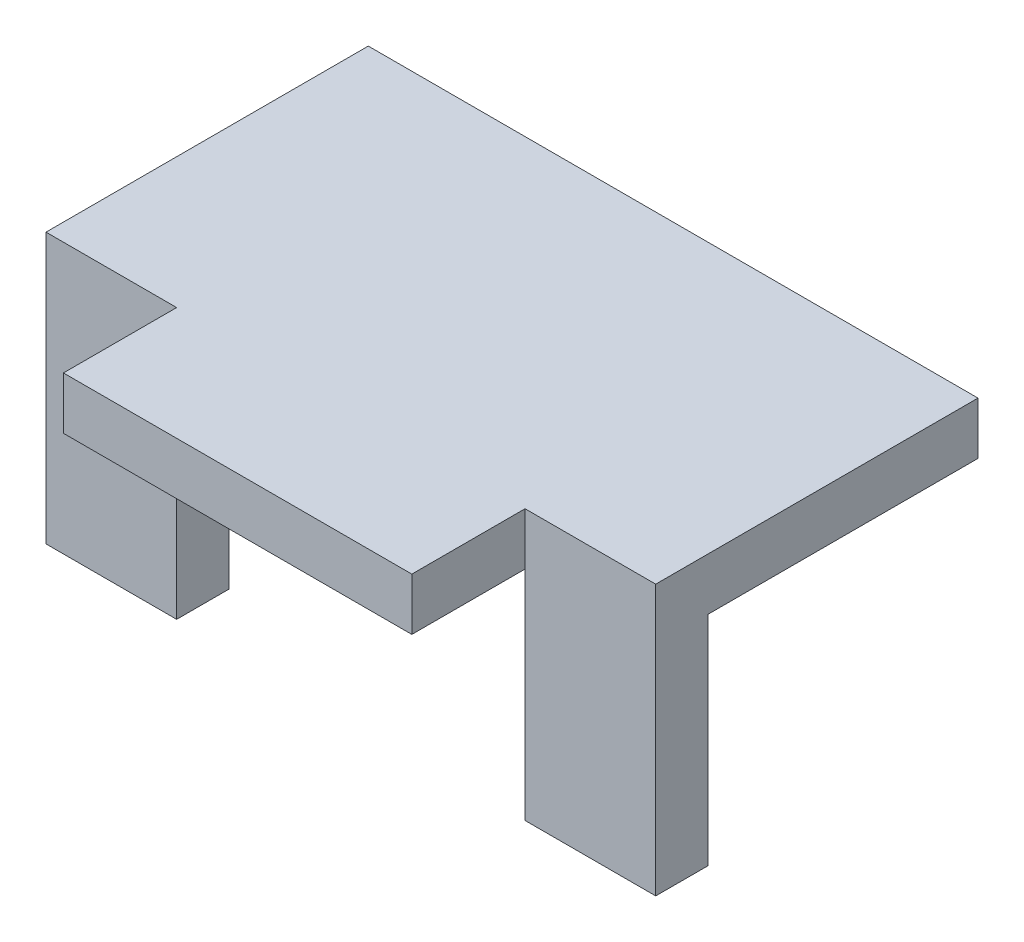
ISO-10303-21;
HEADER;
FILE_DESCRIPTION(('STEP AP214'),'2;1');
FILE_NAME('part.step','',(''),(''),'','','');
FILE_SCHEMA(('AUTOMOTIVE_DESIGN { 1 0 10303 214 1 1 1 1 }'));
ENDSEC;
DATA;
#1=APPLICATION_CONTEXT('core data for automotive mechanical design processes');
#2=APPLICATION_PROTOCOL_DEFINITION('international standard','automotive_design',2000,#1);
#3=PRODUCT_CONTEXT('',#1,'mechanical');
#4=PRODUCT('Part','Part','',(#3));
#5=PRODUCT_RELATED_PRODUCT_CATEGORY('part','',(#4));
#6=PRODUCT_DEFINITION_FORMATION('','',#4);
#7=PRODUCT_DEFINITION_CONTEXT('part definition',#1,'design');
#8=PRODUCT_DEFINITION('design','',#6,#7);
#9=PRODUCT_DEFINITION_SHAPE('','',#8);
#10=(LENGTH_UNIT() NAMED_UNIT(*) SI_UNIT(.MILLI.,.METRE.));
#11=(NAMED_UNIT(*) PLANE_ANGLE_UNIT() SI_UNIT($,.RADIAN.));
#12=(NAMED_UNIT(*) SI_UNIT($,.STERADIAN.) SOLID_ANGLE_UNIT());
#13=UNCERTAINTY_MEASURE_WITH_UNIT(LENGTH_MEASURE(1.E-05),#10,'distance_accuracy_value','');
#14=(GEOMETRIC_REPRESENTATION_CONTEXT(3) GLOBAL_UNCERTAINTY_ASSIGNED_CONTEXT((#13)) GLOBAL_UNIT_ASSIGNED_CONTEXT((#10,
#11,#12)) REPRESENTATION_CONTEXT('',''));
#15=CARTESIAN_POINT('',(0.,0.,0.));
#16=DIRECTION('',(0.,0.,1.));
#17=DIRECTION('',(1.,0.,0.));
#18=AXIS2_PLACEMENT_3D('',#15,#16,#17);
#19=CARTESIAN_POINT('',(0.,0.,0.));
#20=DIRECTION('',(0.,-1.,0.));
#21=DIRECTION('',(0.,0.,-1.));
#22=AXIS2_PLACEMENT_3D('',#19,#20,#21);
#23=PLANE('',#22);
#24=DIRECTION('',(1.,0.,0.));
#25=VECTOR('',#24,1.);
#26=CARTESIAN_POINT('',(20.,0.,6.00000000000001));
#27=LINE('',#26,#25);
#28=CARTESIAN_POINT('',(20.,0.,6.00000000000001));
#29=VERTEX_POINT('',#28);
#30=CARTESIAN_POINT('',(35.,0.,6.00000000000001));
#31=VERTEX_POINT('',#30);
#32=EDGE_CURVE('E150',#29,#31,#27,.T.);
#33=ORIENTED_EDGE('',*,*,#32,.F.);
#34=DIRECTION('',(0.,0.,-1.));
#35=VECTOR('',#34,1.);
#36=CARTESIAN_POINT('',(20.,0.,12.));
#37=LINE('',#36,#35);
#38=CARTESIAN_POINT('',(20.,0.,12.));
#39=VERTEX_POINT('',#38);
#40=EDGE_CURVE('E154',#39,#29,#37,.T.);
#41=ORIENTED_EDGE('',*,*,#40,.F.);
#42=DIRECTION('',(0.,0.,-1.));
#43=VECTOR('',#42,1.);
#44=CARTESIAN_POINT('',(20.,0.,0.));
#45=LINE('',#44,#43);
#46=CARTESIAN_POINT('',(20.,0.,25.));
#47=VERTEX_POINT('',#46);
#48=EDGE_CURVE('E11',#47,#39,#45,.T.);
#49=ORIENTED_EDGE('',*,*,#48,.F.);
#50=DIRECTION('',(1.,0.,0.));
#51=VECTOR('',#50,1.);
#52=CARTESIAN_POINT('',(-35.,0.,25.));
#53=LINE('',#52,#51);
#54=CARTESIAN_POINT('',(-20.,0.,25.));
#55=VERTEX_POINT('',#54);
#56=EDGE_CURVE('E213',#55,#47,#53,.T.);
#57=ORIENTED_EDGE('',*,*,#56,.F.);
#58=DIRECTION('',(0.,0.,1.));
#59=VECTOR('',#58,1.);
#60=CARTESIAN_POINT('',(-20.,0.,12.));
#61=LINE('',#60,#59);
#62=CARTESIAN_POINT('',(-20.,0.,12.));
#63=VERTEX_POINT('',#62);
#64=EDGE_CURVE('E193',#63,#55,#61,.T.);
#65=ORIENTED_EDGE('',*,*,#64,.F.);
#66=DIRECTION('',(0.,0.,1.));
#67=VECTOR('',#66,1.);
#68=CARTESIAN_POINT('',(-20.,0.,12.));
#69=LINE('',#68,#67);
#70=CARTESIAN_POINT('',(-20.,0.,6.00000000000001));
#71=VERTEX_POINT('',#70);
#72=EDGE_CURVE('E156',#71,#63,#69,.T.);
#73=ORIENTED_EDGE('',*,*,#72,.F.);
#74=DIRECTION('',(1.,0.,0.));
#75=VECTOR('',#74,1.);
#76=CARTESIAN_POINT('',(-20.,0.,6.00000000000001));
#77=LINE('',#76,#75);
#78=CARTESIAN_POINT('',(-35.,0.,6.00000000000001));
#79=VERTEX_POINT('',#78);
#80=EDGE_CURVE('E50',#79,#71,#77,.T.);
#81=ORIENTED_EDGE('',*,*,#80,.F.);
#82=DIRECTION('',(0.,0.,1.));
#83=VECTOR('',#82,1.);
#84=CARTESIAN_POINT('',(-35.,0.,25.));
#85=LINE('',#84,#83);
#86=CARTESIAN_POINT('',(-35.,0.,-25.));
#87=VERTEX_POINT('',#86);
#88=EDGE_CURVE('E225',#87,#79,#85,.T.);
#89=ORIENTED_EDGE('',*,*,#88,.F.);
#90=DIRECTION('',(-1.,0.,0.));
#91=VECTOR('',#90,1.);
#92=CARTESIAN_POINT('',(-35.,0.,-25.));
#93=LINE('',#92,#91);
#94=CARTESIAN_POINT('',(35.,0.,-25.));
#95=VERTEX_POINT('',#94);
#96=EDGE_CURVE('E223',#95,#87,#93,.T.);
#97=ORIENTED_EDGE('',*,*,#96,.F.);
#98=DIRECTION('',(0.,0.,-1.));
#99=VECTOR('',#98,1.);
#100=CARTESIAN_POINT('',(35.,0.,25.));
#101=LINE('',#100,#99);
#102=EDGE_CURVE('E209',#31,#95,#101,.T.);
#103=ORIENTED_EDGE('',*,*,#102,.F.);
#104=EDGE_LOOP('',(#33,#41,#49,#57,#65,#73,#81,#89,#97,#103));
#105=FACE_BOUND('',#104,.T.);
#106=ADVANCED_FACE('F33',(#105),#23,.T.);
#107=CARTESIAN_POINT('',(35.,6.,25.));
#108=DIRECTION('',(-1.,0.,0.));
#109=DIRECTION('',(0.,0.,1.));
#110=AXIS2_PLACEMENT_3D('',#107,#108,#109);
#111=PLANE('',#110);
#112=DIRECTION('',(0.,0.,-1.));
#113=VECTOR('',#112,1.);
#114=CARTESIAN_POINT('',(35.,6.,25.));
#115=LINE('',#114,#113);
#116=CARTESIAN_POINT('',(35.,6.,12.));
#117=VERTEX_POINT('',#116);
#118=CARTESIAN_POINT('',(35.,6.,-25.));
#119=VERTEX_POINT('',#118);
#120=EDGE_CURVE('E210',#117,#119,#115,.T.);
#121=ORIENTED_EDGE('',*,*,#120,.F.);
#122=DIRECTION('',(0.,-1.,0.));
#123=VECTOR('',#122,1.);
#124=CARTESIAN_POINT('',(35.,6.,12.));
#125=LINE('',#124,#123);
#126=CARTESIAN_POINT('',(35.,-25.,12.));
#127=VERTEX_POINT('',#126);
#128=EDGE_CURVE('E191',#117,#127,#125,.T.);
#129=ORIENTED_EDGE('',*,*,#128,.T.);
#130=DIRECTION('',(0.,0.,1.));
#131=VECTOR('',#130,1.);
#132=CARTESIAN_POINT('',(35.,-25.,12.));
#133=LINE('',#132,#131);
#134=CARTESIAN_POINT('',(35.,-25.,6.00000000000001));
#135=VERTEX_POINT('',#134);
#136=EDGE_CURVE('E141',#135,#127,#133,.T.);
#137=ORIENTED_EDGE('',*,*,#136,.F.);
#138=DIRECTION('',(0.,1.,0.));
#139=VECTOR('',#138,1.);
#140=CARTESIAN_POINT('',(35.,-25.,6.00000000000001));
#141=LINE('',#140,#139);
#142=EDGE_CURVE('E137',#135,#31,#141,.T.);
#143=ORIENTED_EDGE('',*,*,#142,.T.);
#144=ORIENTED_EDGE('',*,*,#102,.T.);
#145=DIRECTION('',(0.,-1.,0.));
#146=VECTOR('',#145,1.);
#147=CARTESIAN_POINT('',(35.,6.,-25.));
#148=LINE('',#147,#146);
#149=EDGE_CURVE('E42',#119,#95,#148,.T.);
#150=ORIENTED_EDGE('',*,*,#149,.F.);
#151=EDGE_LOOP('',(#121,#129,#137,#143,#144,#150));
#152=FACE_BOUND('',#151,.T.);
#153=ADVANCED_FACE('F35',(#152),#111,.F.);
#154=CARTESIAN_POINT('',(-35.,6.,-25.));
#155=DIRECTION('',(0.,0.,1.));
#156=DIRECTION('',(1.,0.,0.));
#157=AXIS2_PLACEMENT_3D('',#154,#155,#156);
#158=PLANE('',#157);
#159=ORIENTED_EDGE('',*,*,#96,.T.);
#160=DIRECTION('',(0.,-1.,0.));
#161=VECTOR('',#160,1.);
#162=CARTESIAN_POINT('',(-35.,6.,-25.));
#163=LINE('',#162,#161);
#164=CARTESIAN_POINT('',(-35.,6.,-25.));
#165=VERTEX_POINT('',#164);
#166=EDGE_CURVE('E221',#165,#87,#163,.T.);
#167=ORIENTED_EDGE('',*,*,#166,.F.);
#168=DIRECTION('',(-1.,0.,0.));
#169=VECTOR('',#168,1.);
#170=CARTESIAN_POINT('',(-35.,6.,-25.));
#171=LINE('',#170,#169);
#172=EDGE_CURVE('E212',#119,#165,#171,.T.);
#173=ORIENTED_EDGE('',*,*,#172,.F.);
#174=ORIENTED_EDGE('',*,*,#149,.T.);
#175=EDGE_LOOP('',(#159,#167,#173,#174));
#176=FACE_BOUND('',#175,.T.);
#177=ADVANCED_FACE('F252',(#176),#158,.F.);
#178=CARTESIAN_POINT('',(-35.,6.,25.));
#179=DIRECTION('',(1.,0.,0.));
#180=DIRECTION('',(0.,0.,-1.));
#181=AXIS2_PLACEMENT_3D('',#178,#179,#180);
#182=PLANE('',#181);
#183=ORIENTED_EDGE('',*,*,#88,.T.);
#184=DIRECTION('',(0.,1.,0.));
#185=VECTOR('',#184,1.);
#186=CARTESIAN_POINT('',(-35.,-25.,6.00000000000001));
#187=LINE('',#186,#185);
#188=CARTESIAN_POINT('',(-35.,-25.,6.00000000000001));
#189=VERTEX_POINT('',#188);
#190=EDGE_CURVE('E177',#189,#79,#187,.T.);
#191=ORIENTED_EDGE('',*,*,#190,.F.);
#192=DIRECTION('',(0.,0.,-1.));
#193=VECTOR('',#192,1.);
#194=CARTESIAN_POINT('',(-35.,-25.,12.));
#195=LINE('',#194,#193);
#196=CARTESIAN_POINT('',(-35.,-25.,12.));
#197=VERTEX_POINT('',#196);
#198=EDGE_CURVE('E170',#197,#189,#195,.T.);
#199=ORIENTED_EDGE('',*,*,#198,.F.);
#200=DIRECTION('',(0.,1.,0.));
#201=VECTOR('',#200,1.);
#202=CARTESIAN_POINT('',(-35.,6.,12.));
#203=LINE('',#202,#201);
#204=CARTESIAN_POINT('',(-35.,6.,12.));
#205=VERTEX_POINT('',#204);
#206=EDGE_CURVE('E203',#197,#205,#203,.T.);
#207=ORIENTED_EDGE('',*,*,#206,.T.);
#208=DIRECTION('',(0.,0.,1.));
#209=VECTOR('',#208,1.);
#210=CARTESIAN_POINT('',(-35.,6.,25.));
#211=LINE('',#210,#209);
#212=EDGE_CURVE('E215',#165,#205,#211,.T.);
#213=ORIENTED_EDGE('',*,*,#212,.F.);
#214=ORIENTED_EDGE('',*,*,#166,.T.);
#215=EDGE_LOOP('',(#183,#191,#199,#207,#213,#214));
#216=FACE_BOUND('',#215,.T.);
#217=ADVANCED_FACE('F242',(#216),#182,.F.);
#218=CARTESIAN_POINT('',(-35.,6.,25.));
#219=DIRECTION('',(0.,0.,-1.));
#220=DIRECTION('',(-1.,0.,0.));
#221=AXIS2_PLACEMENT_3D('',#218,#219,#220);
#222=PLANE('',#221);
#223=ORIENTED_EDGE('',*,*,#56,.T.);
#224=DIRECTION('',(0.,1.,0.));
#225=VECTOR('',#224,1.);
#226=CARTESIAN_POINT('',(20.,6.,25.));
#227=LINE('',#226,#225);
#228=CARTESIAN_POINT('',(20.,6.,25.));
#229=VERTEX_POINT('',#228);
#230=EDGE_CURVE('E57',#47,#229,#227,.T.);
#231=ORIENTED_EDGE('',*,*,#230,.T.);
#232=DIRECTION('',(1.,0.,0.));
#233=VECTOR('',#232,1.);
#234=CARTESIAN_POINT('',(-35.,6.,25.));
#235=LINE('',#234,#233);
#236=CARTESIAN_POINT('',(-20.,6.,25.));
#237=VERTEX_POINT('',#236);
#238=EDGE_CURVE('E218',#237,#229,#235,.T.);
#239=ORIENTED_EDGE('',*,*,#238,.F.);
#240=DIRECTION('',(0.,-1.,0.));
#241=VECTOR('',#240,1.);
#242=CARTESIAN_POINT('',(-20.,6.,25.));
#243=LINE('',#242,#241);
#244=EDGE_CURVE('E206',#237,#55,#243,.T.);
#245=ORIENTED_EDGE('',*,*,#244,.T.);
#246=EDGE_LOOP('',(#223,#231,#239,#245));
#247=FACE_BOUND('',#246,.T.);
#248=ADVANCED_FACE('F269',(#247),#222,.F.);
#249=CARTESIAN_POINT('',(0.,6.,0.));
#250=DIRECTION('',(0.,-1.,0.));
#251=DIRECTION('',(0.,0.,-1.));
#252=AXIS2_PLACEMENT_3D('',#249,#250,#251);
#253=PLANE('',#252);
#254=DIRECTION('',(0.,0.,-1.));
#255=VECTOR('',#254,1.);
#256=CARTESIAN_POINT('',(20.,6.,12.));
#257=LINE('',#256,#255);
#258=CARTESIAN_POINT('',(20.,6.,12.));
#259=VERTEX_POINT('',#258);
#260=EDGE_CURVE('E181',#229,#259,#257,.T.);
#261=ORIENTED_EDGE('',*,*,#260,.T.);
#262=DIRECTION('',(1.,0.,0.));
#263=VECTOR('',#262,1.);
#264=CARTESIAN_POINT('',(35.,6.,12.));
#265=LINE('',#264,#263);
#266=EDGE_CURVE('E184',#259,#117,#265,.T.);
#267=ORIENTED_EDGE('',*,*,#266,.T.);
#268=ORIENTED_EDGE('',*,*,#120,.T.);
#269=ORIENTED_EDGE('',*,*,#172,.T.);
#270=ORIENTED_EDGE('',*,*,#212,.T.);
#271=DIRECTION('',(1.,0.,0.));
#272=VECTOR('',#271,1.);
#273=CARTESIAN_POINT('',(-39.6651285228415,6.,12.));
#274=LINE('',#273,#272);
#275=CARTESIAN_POINT('',(-20.,6.,12.));
#276=VERTEX_POINT('',#275);
#277=EDGE_CURVE('E194',#205,#276,#274,.T.);
#278=ORIENTED_EDGE('',*,*,#277,.T.);
#279=DIRECTION('',(0.,0.,1.));
#280=VECTOR('',#279,1.);
#281=CARTESIAN_POINT('',(-20.,6.,12.));
#282=LINE('',#281,#280);
#283=EDGE_CURVE('E197',#276,#237,#282,.T.);
#284=ORIENTED_EDGE('',*,*,#283,.T.);
#285=ORIENTED_EDGE('',*,*,#238,.T.);
#286=EDGE_LOOP('',(#261,#267,#268,#269,#270,#278,#284,#285));
#287=FACE_BOUND('',#286,.T.);
#288=ADVANCED_FACE('F266',(#287),#253,.F.);
#289=CARTESIAN_POINT('',(-20.,6.,12.));
#290=DIRECTION('',(1.,0.,0.));
#291=DIRECTION('',(0.,0.,-1.));
#292=AXIS2_PLACEMENT_3D('',#289,#290,#291);
#293=PLANE('',#292);
#294=ORIENTED_EDGE('',*,*,#283,.F.);
#295=DIRECTION('',(0.,-1.,0.));
#296=VECTOR('',#295,1.);
#297=CARTESIAN_POINT('',(-20.,6.,12.));
#298=LINE('',#297,#296);
#299=EDGE_CURVE('E200',#276,#63,#298,.T.);
#300=ORIENTED_EDGE('',*,*,#299,.T.);
#301=ORIENTED_EDGE('',*,*,#64,.T.);
#302=ORIENTED_EDGE('',*,*,#244,.F.);
#303=EDGE_LOOP('',(#294,#300,#301,#302));
#304=FACE_BOUND('',#303,.T.);
#305=ADVANCED_FACE('F320',(#304),#293,.F.);
#306=CARTESIAN_POINT('',(-35.,6.,12.));
#307=DIRECTION('',(0.,0.,-1.));
#308=DIRECTION('',(-1.,0.,0.));
#309=AXIS2_PLACEMENT_3D('',#306,#307,#308);
#310=PLANE('',#309);
#311=ORIENTED_EDGE('',*,*,#206,.F.);
#312=DIRECTION('',(-1.,0.,0.));
#313=VECTOR('',#312,1.);
#314=CARTESIAN_POINT('',(-20.,-25.,12.));
#315=LINE('',#314,#313);
#316=CARTESIAN_POINT('',(-20.,-25.,12.));
#317=VERTEX_POINT('',#316);
#318=EDGE_CURVE('E167',#317,#197,#315,.T.);
#319=ORIENTED_EDGE('',*,*,#318,.F.);
#320=DIRECTION('',(0.,1.,0.));
#321=VECTOR('',#320,1.);
#322=CARTESIAN_POINT('',(-20.,-25.,12.));
#323=LINE('',#322,#321);
#324=EDGE_CURVE('E178',#317,#63,#323,.T.);
#325=ORIENTED_EDGE('',*,*,#324,.T.);
#326=ORIENTED_EDGE('',*,*,#299,.F.);
#327=ORIENTED_EDGE('',*,*,#277,.F.);
#328=EDGE_LOOP('',(#311,#319,#325,#326,#327));
#329=FACE_BOUND('',#328,.T.);
#330=ADVANCED_FACE('F274',(#329),#310,.F.);
#331=CARTESIAN_POINT('',(39.6651285228416,6.,12.));
#332=DIRECTION('',(0.,0.,-1.));
#333=DIRECTION('',(-1.,0.,0.));
#334=AXIS2_PLACEMENT_3D('',#331,#332,#333);
#335=PLANE('',#334);
#336=ORIENTED_EDGE('',*,*,#266,.F.);
#337=DIRECTION('',(0.,-1.,0.));
#338=VECTOR('',#337,1.);
#339=CARTESIAN_POINT('',(20.,6.,12.));
#340=LINE('',#339,#338);
#341=EDGE_CURVE('E187',#259,#39,#340,.T.);
#342=ORIENTED_EDGE('',*,*,#341,.T.);
#343=DIRECTION('',(0.,1.,0.));
#344=VECTOR('',#343,1.);
#345=CARTESIAN_POINT('',(20.,-25.,12.));
#346=LINE('',#345,#344);
#347=CARTESIAN_POINT('',(20.,-25.,12.));
#348=VERTEX_POINT('',#347);
#349=EDGE_CURVE('E160',#348,#39,#346,.T.);
#350=ORIENTED_EDGE('',*,*,#349,.F.);
#351=DIRECTION('',(-1.,0.,0.));
#352=VECTOR('',#351,1.);
#353=CARTESIAN_POINT('',(20.,-25.,12.));
#354=LINE('',#353,#352);
#355=EDGE_CURVE('E147',#127,#348,#354,.T.);
#356=ORIENTED_EDGE('',*,*,#355,.F.);
#357=ORIENTED_EDGE('',*,*,#128,.F.);
#358=EDGE_LOOP('',(#336,#342,#350,#356,#357));
#359=FACE_BOUND('',#358,.T.);
#360=ADVANCED_FACE('F264',(#359),#335,.F.);
#361=CARTESIAN_POINT('',(20.,6.,12.));
#362=DIRECTION('',(-1.,0.,0.));
#363=DIRECTION('',(0.,0.,1.));
#364=AXIS2_PLACEMENT_3D('',#361,#362,#363);
#365=PLANE('',#364);
#366=ORIENTED_EDGE('',*,*,#48,.T.);
#367=ORIENTED_EDGE('',*,*,#341,.F.);
#368=ORIENTED_EDGE('',*,*,#260,.F.);
#369=ORIENTED_EDGE('',*,*,#230,.F.);
#370=EDGE_LOOP('',(#366,#367,#368,#369));
#371=FACE_BOUND('',#370,.T.);
#372=ADVANCED_FACE('F262',(#371),#365,.F.);
#373=CARTESIAN_POINT('',(-20.,-25.,12.));
#374=DIRECTION('',(-1.,0.,0.));
#375=DIRECTION('',(0.,0.,1.));
#376=AXIS2_PLACEMENT_3D('',#373,#374,#375);
#377=PLANE('',#376);
#378=ORIENTED_EDGE('',*,*,#72,.T.);
#379=ORIENTED_EDGE('',*,*,#324,.F.);
#380=DIRECTION('',(0.,0.,1.));
#381=VECTOR('',#380,1.);
#382=CARTESIAN_POINT('',(-20.,-25.,12.));
#383=LINE('',#382,#381);
#384=CARTESIAN_POINT('',(-20.,-25.,6.00000000000001));
#385=VERTEX_POINT('',#384);
#386=EDGE_CURVE('E164',#385,#317,#383,.T.);
#387=ORIENTED_EDGE('',*,*,#386,.F.);
#388=DIRECTION('',(0.,1.,0.));
#389=VECTOR('',#388,1.);
#390=CARTESIAN_POINT('',(-20.,-25.,6.00000000000001));
#391=LINE('',#390,#389);
#392=EDGE_CURVE('E173',#385,#71,#391,.T.);
#393=ORIENTED_EDGE('',*,*,#392,.T.);
#394=EDGE_LOOP('',(#378,#379,#387,#393));
#395=FACE_BOUND('',#394,.T.);
#396=ADVANCED_FACE('F278',(#395),#377,.F.);
#397=CARTESIAN_POINT('',(-20.,-25.,6.00000000000001));
#398=DIRECTION('',(0.,0.,1.));
#399=DIRECTION('',(1.,0.,0.));
#400=AXIS2_PLACEMENT_3D('',#397,#398,#399);
#401=PLANE('',#400);
#402=ORIENTED_EDGE('',*,*,#80,.T.);
#403=ORIENTED_EDGE('',*,*,#392,.F.);
#404=DIRECTION('',(1.,0.,0.));
#405=VECTOR('',#404,1.);
#406=CARTESIAN_POINT('',(-20.,-25.,6.00000000000001));
#407=LINE('',#406,#405);
#408=EDGE_CURVE('E172',#189,#385,#407,.T.);
#409=ORIENTED_EDGE('',*,*,#408,.F.);
#410=ORIENTED_EDGE('',*,*,#190,.T.);
#411=EDGE_LOOP('',(#402,#403,#409,#410));
#412=FACE_BOUND('',#411,.T.);
#413=ADVANCED_FACE('F238',(#412),#401,.F.);
#414=CARTESIAN_POINT('',(0.,-25.,0.));
#415=DIRECTION('',(0.,1.,0.));
#416=DIRECTION('',(0.,0.,1.));
#417=AXIS2_PLACEMENT_3D('',#414,#415,#416);
#418=PLANE('',#417);
#419=ORIENTED_EDGE('',*,*,#386,.T.);
#420=ORIENTED_EDGE('',*,*,#318,.T.);
#421=ORIENTED_EDGE('',*,*,#198,.T.);
#422=ORIENTED_EDGE('',*,*,#408,.T.);
#423=EDGE_LOOP('',(#419,#420,#421,#422));
#424=FACE_BOUND('',#423,.T.);
#425=ADVANCED_FACE('F280',(#424),#418,.F.);
#426=CARTESIAN_POINT('',(20.,-25.,12.));
#427=DIRECTION('',(1.,0.,0.));
#428=DIRECTION('',(0.,0.,-1.));
#429=AXIS2_PLACEMENT_3D('',#426,#427,#428);
#430=PLANE('',#429);
#431=ORIENTED_EDGE('',*,*,#40,.T.);
#432=DIRECTION('',(0.,1.,0.));
#433=VECTOR('',#432,1.);
#434=CARTESIAN_POINT('',(20.,-25.,6.00000000000001));
#435=LINE('',#434,#433);
#436=CARTESIAN_POINT('',(20.,-25.,6.00000000000001));
#437=VERTEX_POINT('',#436);
#438=EDGE_CURVE('E134',#437,#29,#435,.T.);
#439=ORIENTED_EDGE('',*,*,#438,.F.);
#440=DIRECTION('',(0.,0.,-1.));
#441=VECTOR('',#440,1.);
#442=CARTESIAN_POINT('',(20.,-25.,12.));
#443=LINE('',#442,#441);
#444=EDGE_CURVE('E142',#348,#437,#443,.T.);
#445=ORIENTED_EDGE('',*,*,#444,.F.);
#446=ORIENTED_EDGE('',*,*,#349,.T.);
#447=EDGE_LOOP('',(#431,#439,#445,#446));
#448=FACE_BOUND('',#447,.T.);
#449=ADVANCED_FACE('F152',(#448),#430,.F.);
#450=CARTESIAN_POINT('',(20.,-25.,6.00000000000001));
#451=DIRECTION('',(0.,0.,1.));
#452=DIRECTION('',(1.,0.,0.));
#453=AXIS2_PLACEMENT_3D('',#450,#451,#452);
#454=PLANE('',#453);
#455=ORIENTED_EDGE('',*,*,#32,.T.);
#456=ORIENTED_EDGE('',*,*,#142,.F.);
#457=DIRECTION('',(1.,0.,0.));
#458=VECTOR('',#457,1.);
#459=CARTESIAN_POINT('',(20.,-25.,6.00000000000001));
#460=LINE('',#459,#458);
#461=EDGE_CURVE('E130',#437,#135,#460,.T.);
#462=ORIENTED_EDGE('',*,*,#461,.F.);
#463=ORIENTED_EDGE('',*,*,#438,.T.);
#464=EDGE_LOOP('',(#455,#456,#462,#463));
#465=FACE_BOUND('',#464,.T.);
#466=ADVANCED_FACE('F132',(#465),#454,.F.);
#467=CARTESIAN_POINT('',(0.,-25.,0.));
#468=DIRECTION('',(0.,-1.,0.));
#469=DIRECTION('',(0.,0.,-1.));
#470=AXIS2_PLACEMENT_3D('',#467,#468,#469);
#471=PLANE('',#470);
#472=ORIENTED_EDGE('',*,*,#444,.T.);
#473=ORIENTED_EDGE('',*,*,#461,.T.);
#474=ORIENTED_EDGE('',*,*,#136,.T.);
#475=ORIENTED_EDGE('',*,*,#355,.T.);
#476=EDGE_LOOP('',(#472,#473,#474,#475));
#477=FACE_BOUND('',#476,.T.);
#478=ADVANCED_FACE('F145',(#477),#471,.T.);
#479=CLOSED_SHELL('',(#106,#153,#177,#217,#248,#288,#305,#330,#360,#372,#396,#413,#425,#449,
#466,#478));
#480=MANIFOLD_SOLID_BREP('B2',#479);
#481=ADVANCED_BREP_SHAPE_REPRESENTATION('',(#18,#480),#14);
#482=SHAPE_DEFINITION_REPRESENTATION(#9,#481);
ENDSEC;
END-ISO-10303-21;
